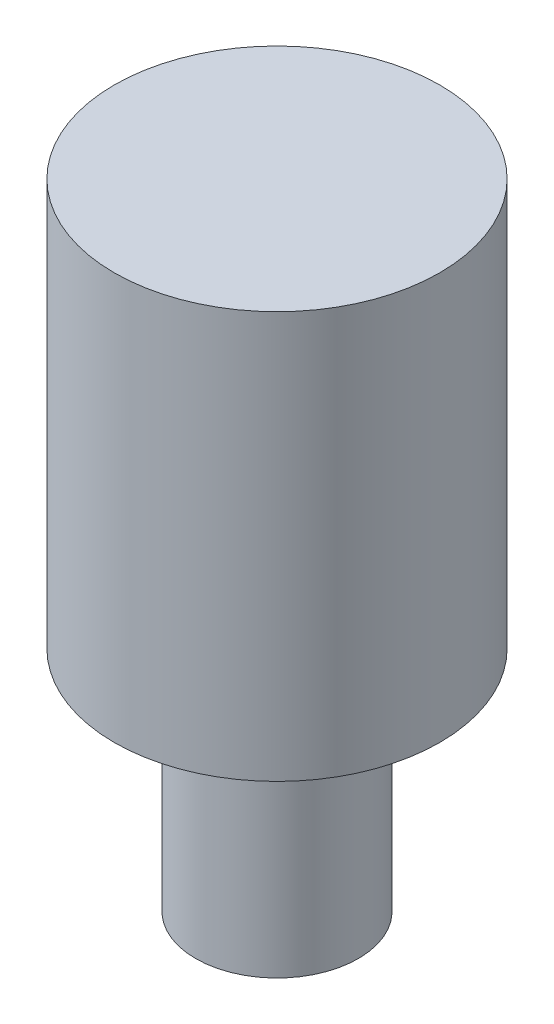
ISO-10303-21;
HEADER;
FILE_DESCRIPTION(('STEP AP214'),'2;1');
FILE_NAME('part.step','',(''),(''),'','','');
FILE_SCHEMA(('AUTOMOTIVE_DESIGN { 1 0 10303 214 1 1 1 1 }'));
ENDSEC;
DATA;
#1=APPLICATION_CONTEXT('core data for automotive mechanical design processes');
#2=APPLICATION_PROTOCOL_DEFINITION('international standard','automotive_design',2000,#1);
#3=PRODUCT_CONTEXT('',#1,'mechanical');
#4=PRODUCT('Part','Part','',(#3));
#5=PRODUCT_RELATED_PRODUCT_CATEGORY('part','',(#4));
#6=PRODUCT_DEFINITION_FORMATION('','',#4);
#7=PRODUCT_DEFINITION_CONTEXT('part definition',#1,'design');
#8=PRODUCT_DEFINITION('design','',#6,#7);
#9=PRODUCT_DEFINITION_SHAPE('','',#8);
#10=(LENGTH_UNIT() NAMED_UNIT(*) SI_UNIT(.MILLI.,.METRE.));
#11=(NAMED_UNIT(*) PLANE_ANGLE_UNIT() SI_UNIT($,.RADIAN.));
#12=(NAMED_UNIT(*) SI_UNIT($,.STERADIAN.) SOLID_ANGLE_UNIT());
#13=UNCERTAINTY_MEASURE_WITH_UNIT(LENGTH_MEASURE(1.E-05),#10,'distance_accuracy_value','');
#14=(GEOMETRIC_REPRESENTATION_CONTEXT(3) GLOBAL_UNCERTAINTY_ASSIGNED_CONTEXT((#13)) GLOBAL_UNIT_ASSIGNED_CONTEXT((#10,
#11,#12)) REPRESENTATION_CONTEXT('',''));
#15=CARTESIAN_POINT('',(0.,0.,0.));
#16=DIRECTION('',(0.,0.,1.));
#17=DIRECTION('',(1.,0.,0.));
#18=AXIS2_PLACEMENT_3D('',#15,#16,#17);
#19=CARTESIAN_POINT('',(0.,2.8,0.));
#20=DIRECTION('',(0.,-1.,0.));
#21=DIRECTION('',(0.,0.,-1.));
#22=AXIS2_PLACEMENT_3D('',#19,#20,#21);
#23=CYLINDRICAL_SURFACE('',#22,1.);
#24=CARTESIAN_POINT('',(0.,2.8,0.));
#25=DIRECTION('',(0.,1.,0.));
#26=DIRECTION('',(0.,0.,1.));
#27=AXIS2_PLACEMENT_3D('',#24,#25,#26);
#28=CIRCLE('',#27,1.);
#29=CARTESIAN_POINT('',(0.,2.8,1.));
#30=VERTEX_POINT('',#29);
#31=EDGE_CURVE('E10',#30,#30,#28,.T.);
#32=ORIENTED_EDGE('',*,*,#31,.F.);
#33=EDGE_LOOP('',(#32));
#34=FACE_BOUND('',#33,.T.);
#35=CARTESIAN_POINT('',(0.,0.,0.));
#36=DIRECTION('',(0.,1.,0.));
#37=DIRECTION('',(0.,0.,1.));
#38=AXIS2_PLACEMENT_3D('',#35,#36,#37);
#39=CIRCLE('',#38,1.);
#40=CARTESIAN_POINT('',(0.,0.,1.));
#41=VERTEX_POINT('',#40);
#42=EDGE_CURVE('E40',#41,#41,#39,.T.);
#43=ORIENTED_EDGE('',*,*,#42,.T.);
#44=EDGE_LOOP('',(#43));
#45=FACE_BOUND('',#44,.T.);
#46=ADVANCED_FACE('F37',(#34,#45),#23,.T.);
#47=CARTESIAN_POINT('',(0.,0.,0.));
#48=DIRECTION('',(0.,1.,0.));
#49=DIRECTION('',(0.,0.,1.));
#50=AXIS2_PLACEMENT_3D('',#47,#48,#49);
#51=PLANE('',#50);
#52=ORIENTED_EDGE('',*,*,#42,.F.);
#53=EDGE_LOOP('',(#52));
#54=FACE_BOUND('',#53,.T.);
#55=ADVANCED_FACE('F64',(#54),#51,.F.);
#56=CARTESIAN_POINT('',(0.,7.8,0.));
#57=DIRECTION('',(0.,-1.,0.));
#58=DIRECTION('',(0.,0.,-1.));
#59=AXIS2_PLACEMENT_3D('',#56,#57,#58);
#60=CYLINDRICAL_SURFACE('',#59,2.);
#61=CARTESIAN_POINT('',(0.,7.8,0.));
#62=DIRECTION('',(0.,1.,0.));
#63=DIRECTION('',(0.,0.,1.));
#64=AXIS2_PLACEMENT_3D('',#61,#62,#63);
#65=CIRCLE('',#64,2.);
#66=CARTESIAN_POINT('',(0.,7.8,2.));
#67=VERTEX_POINT('',#66);
#68=EDGE_CURVE('E49',#67,#67,#65,.T.);
#69=ORIENTED_EDGE('',*,*,#68,.F.);
#70=EDGE_LOOP('',(#69));
#71=FACE_BOUND('',#70,.T.);
#72=CARTESIAN_POINT('',(0.,2.8,0.));
#73=DIRECTION('',(0.,1.,0.));
#74=DIRECTION('',(0.,0.,1.));
#75=AXIS2_PLACEMENT_3D('',#72,#73,#74);
#76=CIRCLE('',#75,2.);
#77=CARTESIAN_POINT('',(0.,2.8,2.));
#78=VERTEX_POINT('',#77);
#79=EDGE_CURVE('E51',#78,#78,#76,.T.);
#80=ORIENTED_EDGE('',*,*,#79,.T.);
#81=EDGE_LOOP('',(#80));
#82=FACE_BOUND('',#81,.T.);
#83=ADVANCED_FACE('F61',(#71,#82),#60,.T.);
#84=CARTESIAN_POINT('',(0.,7.8,0.));
#85=DIRECTION('',(0.,1.,0.));
#86=DIRECTION('',(0.,0.,1.));
#87=AXIS2_PLACEMENT_3D('',#84,#85,#86);
#88=PLANE('',#87);
#89=ORIENTED_EDGE('',*,*,#68,.T.);
#90=EDGE_LOOP('',(#89));
#91=FACE_BOUND('',#90,.T.);
#92=ADVANCED_FACE('F59',(#91),#88,.T.);
#93=CARTESIAN_POINT('',(0.,2.8,0.));
#94=DIRECTION('',(0.,1.,0.));
#95=DIRECTION('',(0.,0.,1.));
#96=AXIS2_PLACEMENT_3D('',#93,#94,#95);
#97=PLANE('',#96);
#98=ORIENTED_EDGE('',*,*,#31,.T.);
#99=EDGE_LOOP('',(#98));
#100=FACE_BOUND('',#99,.T.);
#101=ORIENTED_EDGE('',*,*,#79,.F.);
#102=EDGE_LOOP('',(#101));
#103=FACE_BOUND('',#102,.T.);
#104=ADVANCED_FACE('F68',(#100,#103),#97,.F.);
#105=CLOSED_SHELL('',(#46,#55,#83,#92,#104));
#106=MANIFOLD_SOLID_BREP('B2',#105);
#107=ADVANCED_BREP_SHAPE_REPRESENTATION('',(#18,#106),#14);
#108=SHAPE_DEFINITION_REPRESENTATION(#9,#107);
ENDSEC;
END-ISO-10303-21;
